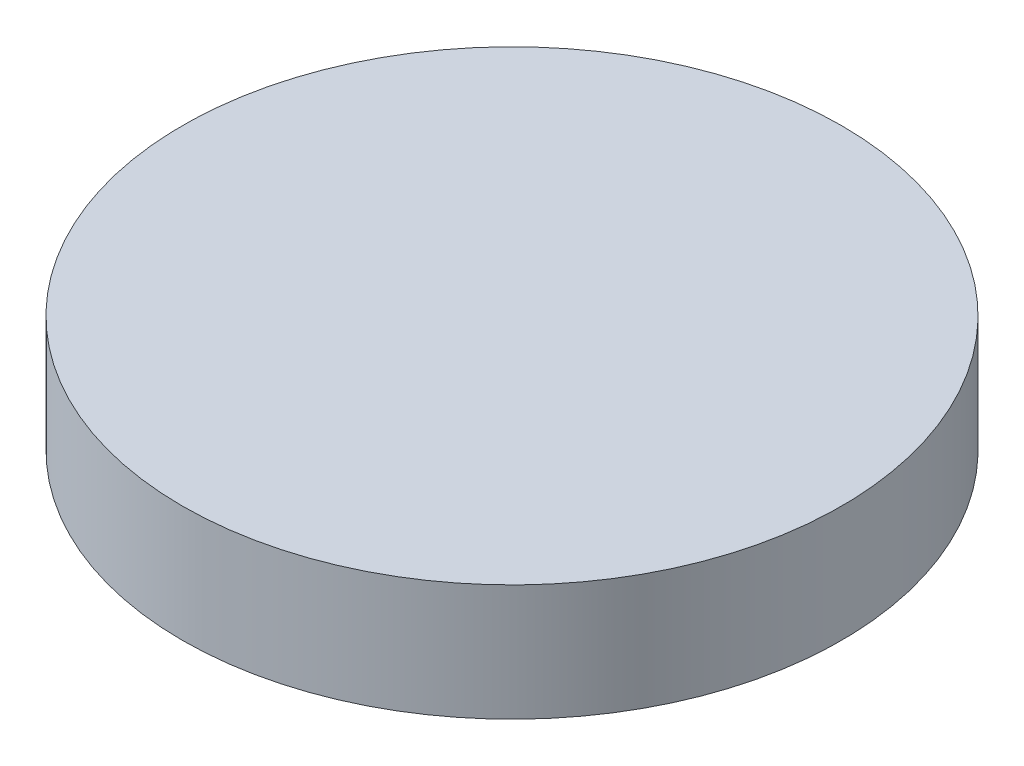
ISO-10303-21;
HEADER;
FILE_DESCRIPTION(('STEP AP214'),'2;1');
FILE_NAME('part.step','',(''),(''),'','','');
FILE_SCHEMA(('AUTOMOTIVE_DESIGN { 1 0 10303 214 1 1 1 1 }'));
ENDSEC;
DATA;
#1=APPLICATION_CONTEXT('core data for automotive mechanical design processes');
#2=APPLICATION_PROTOCOL_DEFINITION('international standard','automotive_design',2000,#1);
#3=PRODUCT_CONTEXT('',#1,'mechanical');
#4=PRODUCT('Part','Part','',(#3));
#5=PRODUCT_RELATED_PRODUCT_CATEGORY('part','',(#4));
#6=PRODUCT_DEFINITION_FORMATION('','',#4);
#7=PRODUCT_DEFINITION_CONTEXT('part definition',#1,'design');
#8=PRODUCT_DEFINITION('design','',#6,#7);
#9=PRODUCT_DEFINITION_SHAPE('','',#8);
#10=(LENGTH_UNIT() NAMED_UNIT(*) SI_UNIT(.MILLI.,.METRE.));
#11=(NAMED_UNIT(*) PLANE_ANGLE_UNIT() SI_UNIT($,.RADIAN.));
#12=(NAMED_UNIT(*) SI_UNIT($,.STERADIAN.) SOLID_ANGLE_UNIT());
#13=UNCERTAINTY_MEASURE_WITH_UNIT(LENGTH_MEASURE(1.E-05),#10,'distance_accuracy_value','');
#14=(GEOMETRIC_REPRESENTATION_CONTEXT(3) GLOBAL_UNCERTAINTY_ASSIGNED_CONTEXT((#13)) GLOBAL_UNIT_ASSIGNED_CONTEXT((#10,
#11,#12)) REPRESENTATION_CONTEXT('',''));
#15=CARTESIAN_POINT('',(0.,0.,0.));
#16=DIRECTION('',(0.,0.,1.));
#17=DIRECTION('',(1.,0.,0.));
#18=AXIS2_PLACEMENT_3D('',#15,#16,#17);
#19=CARTESIAN_POINT('',(0.,6.,0.));
#20=DIRECTION('',(0.,-1.,0.));
#21=DIRECTION('',(0.,0.,-1.));
#22=AXIS2_PLACEMENT_3D('',#19,#20,#21);
#23=CYLINDRICAL_SURFACE('',#22,17.);
#24=CARTESIAN_POINT('',(0.,6.,0.));
#25=DIRECTION('',(0.,1.,0.));
#26=DIRECTION('',(0.,0.,1.));
#27=AXIS2_PLACEMENT_3D('',#24,#25,#26);
#28=CIRCLE('',#27,17.);
#29=CARTESIAN_POINT('',(0.,6.,17.));
#30=VERTEX_POINT('',#29);
#31=EDGE_CURVE('E11',#30,#30,#28,.T.);
#32=ORIENTED_EDGE('',*,*,#31,.F.);
#33=EDGE_LOOP('',(#32));
#34=FACE_BOUND('',#33,.T.);
#35=CARTESIAN_POINT('',(0.,0.,0.));
#36=DIRECTION('',(0.,1.,0.));
#37=DIRECTION('',(0.,0.,1.));
#38=AXIS2_PLACEMENT_3D('',#35,#36,#37);
#39=CIRCLE('',#38,17.);
#40=CARTESIAN_POINT('',(0.,0.,17.));
#41=VERTEX_POINT('',#40);
#42=EDGE_CURVE('E36',#41,#41,#39,.T.);
#43=ORIENTED_EDGE('',*,*,#42,.T.);
#44=EDGE_LOOP('',(#43));
#45=FACE_BOUND('',#44,.T.);
#46=ADVANCED_FACE('F33',(#34,#45),#23,.T.);
#47=CARTESIAN_POINT('',(0.,6.,0.));
#48=DIRECTION('',(0.,1.,0.));
#49=DIRECTION('',(0.,0.,1.));
#50=AXIS2_PLACEMENT_3D('',#47,#48,#49);
#51=PLANE('',#50);
#52=ORIENTED_EDGE('',*,*,#31,.T.);
#53=EDGE_LOOP('',(#52));
#54=FACE_BOUND('',#53,.T.);
#55=ADVANCED_FACE('F49',(#54),#51,.T.);
#56=CARTESIAN_POINT('',(0.,0.,0.));
#57=DIRECTION('',(0.,1.,0.));
#58=DIRECTION('',(0.,0.,1.));
#59=AXIS2_PLACEMENT_3D('',#56,#57,#58);
#60=PLANE('',#59);
#61=ORIENTED_EDGE('',*,*,#42,.F.);
#62=EDGE_LOOP('',(#61));
#63=FACE_BOUND('',#62,.T.);
#64=ADVANCED_FACE('F47',(#63),#60,.F.);
#65=CLOSED_SHELL('',(#46,#55,#64));
#66=MANIFOLD_SOLID_BREP('B2',#65);
#67=ADVANCED_BREP_SHAPE_REPRESENTATION('',(#18,#66),#14);
#68=SHAPE_DEFINITION_REPRESENTATION(#9,#67);
ENDSEC;
END-ISO-10303-21;
